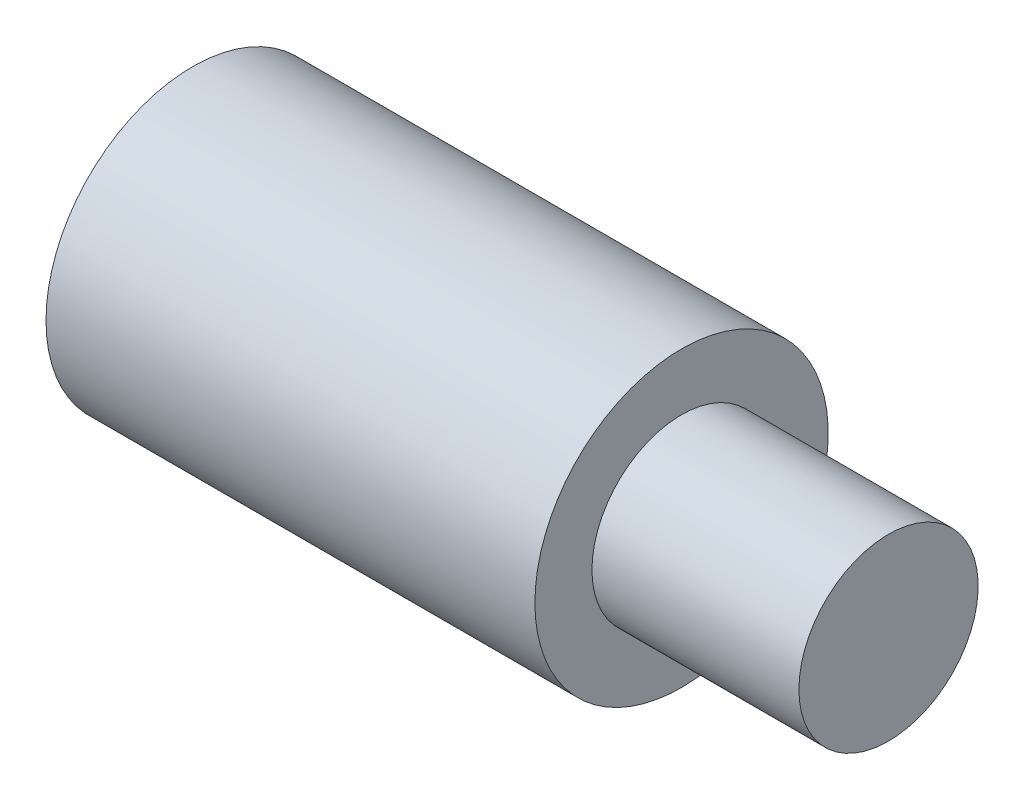
ISO-10303-21;
HEADER;
FILE_DESCRIPTION(('STEP AP214'),'2;1');
FILE_NAME('part.step','',(''),(''),'','','');
FILE_SCHEMA(('AUTOMOTIVE_DESIGN { 1 0 10303 214 1 1 1 1 }'));
ENDSEC;
DATA;
#1=APPLICATION_CONTEXT('core data for automotive mechanical design processes');
#2=APPLICATION_PROTOCOL_DEFINITION('international standard','automotive_design',2000,#1);
#3=PRODUCT_CONTEXT('',#1,'mechanical');
#4=PRODUCT('Part','Part','',(#3));
#5=PRODUCT_RELATED_PRODUCT_CATEGORY('part','',(#4));
#6=PRODUCT_DEFINITION_FORMATION('','',#4);
#7=PRODUCT_DEFINITION_CONTEXT('part definition',#1,'design');
#8=PRODUCT_DEFINITION('design','',#6,#7);
#9=PRODUCT_DEFINITION_SHAPE('','',#8);
#10=(LENGTH_UNIT() NAMED_UNIT(*) SI_UNIT(.MILLI.,.METRE.));
#11=(NAMED_UNIT(*) PLANE_ANGLE_UNIT() SI_UNIT($,.RADIAN.));
#12=(NAMED_UNIT(*) SI_UNIT($,.STERADIAN.) SOLID_ANGLE_UNIT());
#13=UNCERTAINTY_MEASURE_WITH_UNIT(LENGTH_MEASURE(1.E-05),#10,'distance_accuracy_value','');
#14=(GEOMETRIC_REPRESENTATION_CONTEXT(3) GLOBAL_UNCERTAINTY_ASSIGNED_CONTEXT((#13)) GLOBAL_UNIT_ASSIGNED_CONTEXT((#10,
#11,#12)) REPRESENTATION_CONTEXT('',''));
#15=CARTESIAN_POINT('',(0.,0.,0.));
#16=DIRECTION('',(0.,0.,1.));
#17=DIRECTION('',(1.,0.,0.));
#18=AXIS2_PLACEMENT_3D('',#15,#16,#17);
#19=CARTESIAN_POINT('',(12.7,0.,0.));
#20=DIRECTION('',(-1.,0.,0.));
#21=DIRECTION('',(0.,0.,1.));
#22=AXIS2_PLACEMENT_3D('',#19,#20,#21);
#23=PLANE('',#22);
#24=CARTESIAN_POINT('',(12.6999999999999,0.,0.));
#25=DIRECTION('',(-1.,0.,0.));
#26=DIRECTION('',(0.,0.,1.));
#27=AXIS2_PLACEMENT_3D('',#24,#25,#26);
#28=CIRCLE('',#27,5.5);
#29=CARTESIAN_POINT('',(12.6999999999999,0.,5.5));
#30=VERTEX_POINT('',#29);
#31=EDGE_CURVE('E10',#30,#30,#28,.T.);
#32=ORIENTED_EDGE('',*,*,#31,.F.);
#33=EDGE_LOOP('',(#32));
#34=FACE_BOUND('',#33,.T.);
#35=ADVANCED_FACE('F39',(#34),#23,.F.);
#36=CARTESIAN_POINT('',(-1000.,0.,0.));
#37=DIRECTION('',(-1.,0.,0.));
#38=DIRECTION('',(0.,0.,1.));
#39=AXIS2_PLACEMENT_3D('',#36,#37,#38);
#40=CYLINDRICAL_SURFACE('',#39,5.5);
#41=CARTESIAN_POINT('',(0.,0.,0.));
#42=DIRECTION('',(-1.,0.,0.));
#43=DIRECTION('',(0.,0.,1.));
#44=AXIS2_PLACEMENT_3D('',#41,#42,#43);
#45=CIRCLE('',#44,5.5);
#46=CARTESIAN_POINT('',(0.,0.,5.5));
#47=VERTEX_POINT('',#46);
#48=EDGE_CURVE('E46',#47,#47,#45,.T.);
#49=ORIENTED_EDGE('',*,*,#48,.F.);
#50=EDGE_LOOP('',(#49));
#51=FACE_BOUND('',#50,.T.);
#52=ORIENTED_EDGE('',*,*,#31,.T.);
#53=EDGE_LOOP('',(#52));
#54=FACE_BOUND('',#53,.T.);
#55=ADVANCED_FACE('F84',(#51,#54),#40,.T.);
#56=CARTESIAN_POINT('',(0.,5.5,0.));
#57=DIRECTION('',(-1.,0.,0.));
#58=DIRECTION('',(0.,0.,1.));
#59=AXIS2_PLACEMENT_3D('',#56,#57,#58);
#60=PLANE('',#59);
#61=CARTESIAN_POINT('',(0.,0.,0.));
#62=DIRECTION('',(-1.,0.,0.));
#63=DIRECTION('',(0.,0.,1.));
#64=AXIS2_PLACEMENT_3D('',#61,#62,#63);
#65=CIRCLE('',#64,9.);
#66=CARTESIAN_POINT('',(0.,0.,9.));
#67=VERTEX_POINT('',#66);
#68=EDGE_CURVE('E49',#67,#67,#65,.T.);
#69=ORIENTED_EDGE('',*,*,#68,.F.);
#70=EDGE_LOOP('',(#69));
#71=FACE_BOUND('',#70,.T.);
#72=ORIENTED_EDGE('',*,*,#48,.T.);
#73=EDGE_LOOP('',(#72));
#74=FACE_BOUND('',#73,.T.);
#75=ADVANCED_FACE('F76',(#71,#74),#60,.F.);
#76=CARTESIAN_POINT('',(-1000.,0.,0.));
#77=DIRECTION('',(-1.,0.,0.));
#78=DIRECTION('',(0.,0.,1.));
#79=AXIS2_PLACEMENT_3D('',#76,#77,#78);
#80=CYLINDRICAL_SURFACE('',#79,9.);
#81=CARTESIAN_POINT('',(-30.,0.,0.));
#82=DIRECTION('',(-1.,0.,0.));
#83=DIRECTION('',(0.,0.,1.));
#84=AXIS2_PLACEMENT_3D('',#81,#82,#83);
#85=CIRCLE('',#84,9.);
#86=CARTESIAN_POINT('',(-30.,0.,9.));
#87=VERTEX_POINT('',#86);
#88=EDGE_CURVE('E54',#87,#87,#85,.T.);
#89=ORIENTED_EDGE('',*,*,#88,.F.);
#90=EDGE_LOOP('',(#89));
#91=FACE_BOUND('',#90,.T.);
#92=ORIENTED_EDGE('',*,*,#68,.T.);
#93=EDGE_LOOP('',(#92));
#94=FACE_BOUND('',#93,.T.);
#95=ADVANCED_FACE('F68',(#91,#94),#80,.T.);
#96=CARTESIAN_POINT('',(-30.,9.,0.));
#97=DIRECTION('',(1.,0.,0.));
#98=DIRECTION('',(0.,0.,-1.));
#99=AXIS2_PLACEMENT_3D('',#96,#97,#98);
#100=PLANE('',#99);
#101=CARTESIAN_POINT('',(-30.,0.,0.));
#102=DIRECTION('',(1.,0.,0.));
#103=DIRECTION('',(0.,0.,-1.));
#104=AXIS2_PLACEMENT_3D('',#101,#102,#103);
#105=CIRCLE('',#104,5.5);
#106=CARTESIAN_POINT('',(-30.,0.,-5.5));
#107=VERTEX_POINT('',#106);
#108=EDGE_CURVE('E45',#107,#107,#105,.F.);
#109=ORIENTED_EDGE('',*,*,#108,.F.);
#110=EDGE_LOOP('',(#109));
#111=FACE_BOUND('',#110,.T.);
#112=ORIENTED_EDGE('',*,*,#88,.T.);
#113=EDGE_LOOP('',(#112));
#114=FACE_BOUND('',#113,.T.);
#115=ADVANCED_FACE('F69',(#111,#114),#100,.F.);
#116=CARTESIAN_POINT('',(-1000.,0.,0.));
#117=DIRECTION('',(-1.,0.,0.));
#118=DIRECTION('',(0.,0.,1.));
#119=AXIS2_PLACEMENT_3D('',#116,#117,#118);
#120=CYLINDRICAL_SURFACE('',#119,5.5);
#121=CARTESIAN_POINT('',(-16.,0.,0.));
#122=DIRECTION('',(-1.,0.,0.));
#123=DIRECTION('',(0.,0.,1.));
#124=AXIS2_PLACEMENT_3D('',#121,#122,#123);
#125=CIRCLE('',#124,5.5);
#126=CARTESIAN_POINT('',(-16.,0.,5.5));
#127=VERTEX_POINT('',#126);
#128=EDGE_CURVE('E59',#127,#127,#125,.T.);
#129=ORIENTED_EDGE('',*,*,#128,.F.);
#130=EDGE_LOOP('',(#129));
#131=FACE_BOUND('',#130,.T.);
#132=ORIENTED_EDGE('',*,*,#108,.T.);
#133=EDGE_LOOP('',(#132));
#134=FACE_BOUND('',#133,.T.);
#135=ADVANCED_FACE('F64',(#131,#134),#120,.F.);
#136=CARTESIAN_POINT('',(-16.,5.5,0.));
#137=DIRECTION('',(-1.,0.,0.));
#138=DIRECTION('',(0.,0.,1.));
#139=AXIS2_PLACEMENT_3D('',#136,#137,#138);
#140=PLANE('',#139);
#141=ORIENTED_EDGE('',*,*,#128,.T.);
#142=EDGE_LOOP('',(#141));
#143=FACE_BOUND('',#142,.T.);
#144=ADVANCED_FACE('F94',(#143),#140,.T.);
#145=CLOSED_SHELL('',(#35,#55,#75,#95,#115,#135,#144));
#146=MANIFOLD_SOLID_BREP('B2',#145);
#147=ADVANCED_BREP_SHAPE_REPRESENTATION('',(#18,#146),#14);
#148=SHAPE_DEFINITION_REPRESENTATION(#9,#147);
ENDSEC;
END-ISO-10303-21;
